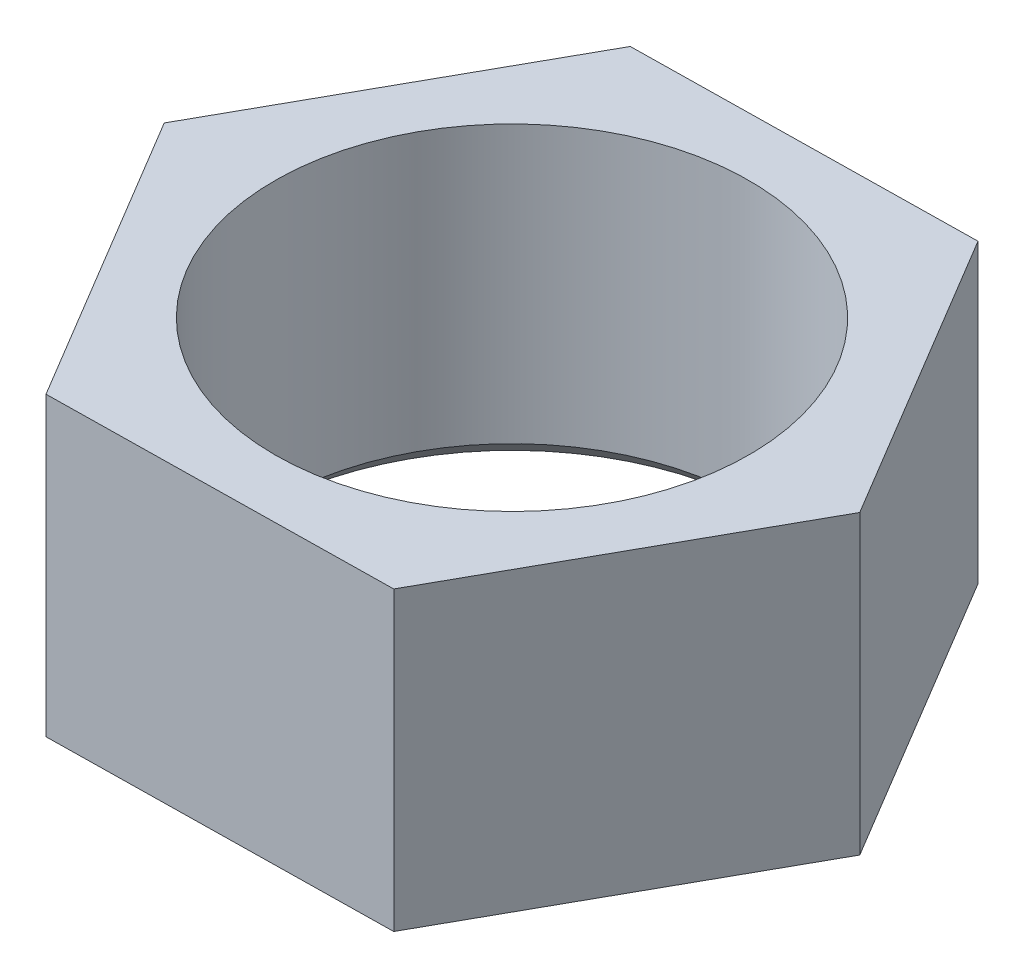
ISO-10303-21;
HEADER;
FILE_DESCRIPTION(('STEP AP214'),'2;1');
FILE_NAME('part.step','',(''),(''),'','','');
FILE_SCHEMA(('AUTOMOTIVE_DESIGN { 1 0 10303 214 1 1 1 1 }'));
ENDSEC;
DATA;
#1=APPLICATION_CONTEXT('core data for automotive mechanical design processes');
#2=APPLICATION_PROTOCOL_DEFINITION('international standard','automotive_design',2000,#1);
#3=PRODUCT_CONTEXT('',#1,'mechanical');
#4=PRODUCT('Part','Part','',(#3));
#5=PRODUCT_RELATED_PRODUCT_CATEGORY('part','',(#4));
#6=PRODUCT_DEFINITION_FORMATION('','',#4);
#7=PRODUCT_DEFINITION_CONTEXT('part definition',#1,'design');
#8=PRODUCT_DEFINITION('design','',#6,#7);
#9=PRODUCT_DEFINITION_SHAPE('','',#8);
#10=(LENGTH_UNIT() NAMED_UNIT(*) SI_UNIT(.MILLI.,.METRE.));
#11=(NAMED_UNIT(*) PLANE_ANGLE_UNIT() SI_UNIT($,.RADIAN.));
#12=(NAMED_UNIT(*) SI_UNIT($,.STERADIAN.) SOLID_ANGLE_UNIT());
#13=UNCERTAINTY_MEASURE_WITH_UNIT(LENGTH_MEASURE(1.E-05),#10,'distance_accuracy_value','');
#14=(GEOMETRIC_REPRESENTATION_CONTEXT(3) GLOBAL_UNCERTAINTY_ASSIGNED_CONTEXT((#13)) GLOBAL_UNIT_ASSIGNED_CONTEXT((#10,
#11,#12)) REPRESENTATION_CONTEXT('',''));
#15=CARTESIAN_POINT('',(0.,0.,0.));
#16=DIRECTION('',(0.,0.,1.));
#17=DIRECTION('',(1.,0.,0.));
#18=AXIS2_PLACEMENT_3D('',#15,#16,#17);
#19=CARTESIAN_POINT('',(-8.43068826921321,15.,15.1302179530683));
#20=DIRECTION('',(-0.0152373569444211,0.,-0.999883904737619));
#21=DIRECTION('',(-0.999883904737619,0.,0.0152373569444211));
#22=AXIS2_PLACEMENT_3D('',#19,#20,#21);
#23=PLANE('',#22);
#24=DIRECTION('',(0.999883904737619,0.,-0.0152373569444211));
#25=VECTOR('',#24,1.);
#26=CARTESIAN_POINT('',(-8.43068826921321,0.,15.1302179530683));
#27=LINE('',#26,#25);
#28=CARTESIAN_POINT('',(-8.43068826921321,0.,15.1302179530683));
#29=VERTEX_POINT('',#28);
#30=CARTESIAN_POINT('',(8.88780897754592,0.,14.8662991890603));
#31=VERTEX_POINT('',#30);
#32=EDGE_CURVE('E133',#29,#31,#27,.T.);
#33=ORIENTED_EDGE('',*,*,#32,.T.);
#34=DIRECTION('',(0.,-1.,0.));
#35=VECTOR('',#34,1.);
#36=CARTESIAN_POINT('',(8.88780897754592,15.,14.8662991890603));
#37=LINE('',#36,#35);
#38=CARTESIAN_POINT('',(8.88780897754592,15.,14.8662991890603));
#39=VERTEX_POINT('',#38);
#40=EDGE_CURVE('E161',#39,#31,#37,.T.);
#41=ORIENTED_EDGE('',*,*,#40,.F.);
#42=DIRECTION('',(0.999883904737619,0.,-0.0152373569444211));
#43=VECTOR('',#42,1.);
#44=CARTESIAN_POINT('',(-8.43068826921321,15.,15.1302179530683));
#45=LINE('',#44,#43);
#46=CARTESIAN_POINT('',(-8.43068826921321,15.,15.1302179530683));
#47=VERTEX_POINT('',#46);
#48=EDGE_CURVE('E150',#47,#39,#45,.T.);
#49=ORIENTED_EDGE('',*,*,#48,.F.);
#50=DIRECTION('',(0.,-1.,0.));
#51=VECTOR('',#50,1.);
#52=CARTESIAN_POINT('',(-8.43068826921321,15.,15.1302179530683));
#53=LINE('',#52,#51);
#54=EDGE_CURVE('E129',#47,#29,#53,.T.);
#55=ORIENTED_EDGE('',*,*,#54,.T.);
#56=EDGE_LOOP('',(#33,#41,#49,#55));
#57=FACE_BOUND('',#56,.T.);
#58=ADVANCED_FACE('F41',(#57),#23,.F.);
#59=CARTESIAN_POINT('',(8.88780897754592,15.,14.8662991890603));
#60=DIRECTION('',(-0.873543540810168,0.,-0.48674601416841));
#61=DIRECTION('',(-0.48674601416841,0.,0.873543540810168));
#62=AXIS2_PLACEMENT_3D('',#59,#60,#61);
#63=PLANE('',#62);
#64=DIRECTION('',(0.48674601416841,0.,-0.873543540810168));
#65=VECTOR('',#64,1.);
#66=CARTESIAN_POINT('',(8.88780897754592,0.,14.8662991890603));
#67=LINE('',#66,#65);
#68=CARTESIAN_POINT('',(17.3184972467592,0.,-0.263918764007998));
#69=VERTEX_POINT('',#68);
#70=EDGE_CURVE('E137',#31,#69,#67,.T.);
#71=ORIENTED_EDGE('',*,*,#70,.T.);
#72=DIRECTION('',(0.,-1.,0.));
#73=VECTOR('',#72,1.);
#74=CARTESIAN_POINT('',(17.3184972467592,15.,-0.263918764007998));
#75=LINE('',#74,#73);
#76=CARTESIAN_POINT('',(17.3184972467592,15.,-0.263918764007998));
#77=VERTEX_POINT('',#76);
#78=EDGE_CURVE('E157',#77,#69,#75,.T.);
#79=ORIENTED_EDGE('',*,*,#78,.F.);
#80=DIRECTION('',(0.48674601416841,0.,-0.873543540810168));
#81=VECTOR('',#80,1.);
#82=CARTESIAN_POINT('',(8.88780897754592,15.,14.8662991890603));
#83=LINE('',#82,#81);
#84=EDGE_CURVE('E98',#39,#77,#83,.T.);
#85=ORIENTED_EDGE('',*,*,#84,.F.);
#86=ORIENTED_EDGE('',*,*,#40,.T.);
#87=EDGE_LOOP('',(#71,#79,#85,#86));
#88=FACE_BOUND('',#87,.T.);
#89=ADVANCED_FACE('F180',(#88),#63,.F.);
#90=CARTESIAN_POINT('',(17.3184972467592,15.,-0.263918764007998));
#91=DIRECTION('',(-0.858306183865748,0.,0.513137890569209));
#92=DIRECTION('',(0.513137890569209,0.,0.858306183865748));
#93=AXIS2_PLACEMENT_3D('',#90,#91,#92);
#94=PLANE('',#93);
#95=DIRECTION('',(-0.513137890569209,0.,-0.858306183865748));
#96=VECTOR('',#95,1.);
#97=CARTESIAN_POINT('',(17.3184972467592,0.,-0.263918764007998));
#98=LINE('',#97,#96);
#99=CARTESIAN_POINT('',(8.4306882692133,0.,-15.1302179530683));
#100=VERTEX_POINT('',#99);
#101=EDGE_CURVE('E141',#69,#100,#98,.T.);
#102=ORIENTED_EDGE('',*,*,#101,.T.);
#103=DIRECTION('',(0.,-1.,0.));
#104=VECTOR('',#103,1.);
#105=CARTESIAN_POINT('',(8.4306882692133,15.,-15.1302179530683));
#106=LINE('',#105,#104);
#107=CARTESIAN_POINT('',(8.4306882692133,15.,-15.1302179530683));
#108=VERTEX_POINT('',#107);
#109=EDGE_CURVE('E122',#108,#100,#106,.T.);
#110=ORIENTED_EDGE('',*,*,#109,.F.);
#111=DIRECTION('',(-0.513137890569209,0.,-0.858306183865748));
#112=VECTOR('',#111,1.);
#113=CARTESIAN_POINT('',(17.3184972467592,15.,-0.263918764007998));
#114=LINE('',#113,#112);
#115=EDGE_CURVE('E111',#77,#108,#114,.T.);
#116=ORIENTED_EDGE('',*,*,#115,.F.);
#117=ORIENTED_EDGE('',*,*,#78,.T.);
#118=EDGE_LOOP('',(#102,#110,#116,#117));
#119=FACE_BOUND('',#118,.T.);
#120=ADVANCED_FACE('F185',(#119),#94,.F.);
#121=CARTESIAN_POINT('',(8.4306882692133,15.,-15.1302179530683));
#122=DIRECTION('',(0.0152373569444207,0.,0.999883904737619));
#123=DIRECTION('',(0.999883904737619,0.,-0.0152373569444207));
#124=AXIS2_PLACEMENT_3D('',#121,#122,#123);
#125=PLANE('',#124);
#126=DIRECTION('',(-0.999883904737619,0.,0.0152373569444207));
#127=VECTOR('',#126,1.);
#128=CARTESIAN_POINT('',(8.4306882692133,0.,-15.1302179530683));
#129=LINE('',#128,#127);
#130=CARTESIAN_POINT('',(-8.88780897754586,0.,-14.8662991890603));
#131=VERTEX_POINT('',#130);
#132=EDGE_CURVE('E120',#100,#131,#129,.T.);
#133=ORIENTED_EDGE('',*,*,#132,.T.);
#134=DIRECTION('',(0.,-1.,0.));
#135=VECTOR('',#134,1.);
#136=CARTESIAN_POINT('',(-8.88780897754586,15.,-14.8662991890603));
#137=LINE('',#136,#135);
#138=CARTESIAN_POINT('',(-8.88780897754586,15.,-14.8662991890603));
#139=VERTEX_POINT('',#138);
#140=EDGE_CURVE('E117',#139,#131,#137,.T.);
#141=ORIENTED_EDGE('',*,*,#140,.F.);
#142=DIRECTION('',(-0.999883904737619,0.,0.0152373569444207));
#143=VECTOR('',#142,1.);
#144=CARTESIAN_POINT('',(8.4306882692133,15.,-15.1302179530683));
#145=LINE('',#144,#143);
#146=EDGE_CURVE('E105',#108,#139,#145,.T.);
#147=ORIENTED_EDGE('',*,*,#146,.F.);
#148=ORIENTED_EDGE('',*,*,#109,.T.);
#149=EDGE_LOOP('',(#133,#141,#147,#148));
#150=FACE_BOUND('',#149,.T.);
#151=ADVANCED_FACE('F118',(#150),#125,.F.);
#152=CARTESIAN_POINT('',(-8.88780897754586,15.,-14.8662991890603));
#153=DIRECTION('',(0.873543540810168,0.,0.48674601416841));
#154=DIRECTION('',(0.48674601416841,0.,-0.873543540810169));
#155=AXIS2_PLACEMENT_3D('',#152,#153,#154);
#156=PLANE('',#155);
#157=DIRECTION('',(-0.48674601416841,0.,0.873543540810169));
#158=VECTOR('',#157,1.);
#159=CARTESIAN_POINT('',(-8.88780897754586,0.,-14.8662991890603));
#160=LINE('',#159,#158);
#161=CARTESIAN_POINT('',(-17.3184972467592,0.,0.263918764007991));
#162=VERTEX_POINT('',#161);
#163=EDGE_CURVE('E83',#131,#162,#160,.T.);
#164=ORIENTED_EDGE('',*,*,#163,.T.);
#165=DIRECTION('',(0.,-1.,0.));
#166=VECTOR('',#165,1.);
#167=CARTESIAN_POINT('',(-17.3184972467592,15.,0.263918764007991));
#168=LINE('',#167,#166);
#169=CARTESIAN_POINT('',(-17.3184972467592,15.,0.263918764007991));
#170=VERTEX_POINT('',#169);
#171=EDGE_CURVE('E123',#170,#162,#168,.T.);
#172=ORIENTED_EDGE('',*,*,#171,.F.);
#173=DIRECTION('',(-0.48674601416841,0.,0.873543540810169));
#174=VECTOR('',#173,1.);
#175=CARTESIAN_POINT('',(-8.88780897754586,15.,-14.8662991890603));
#176=LINE('',#175,#174);
#177=EDGE_CURVE('E109',#139,#170,#176,.T.);
#178=ORIENTED_EDGE('',*,*,#177,.F.);
#179=ORIENTED_EDGE('',*,*,#140,.T.);
#180=EDGE_LOOP('',(#164,#172,#178,#179));
#181=FACE_BOUND('',#180,.T.);
#182=ADVANCED_FACE('F125',(#181),#156,.F.);
#183=CARTESIAN_POINT('',(-17.3184972467592,15.,0.263918764007991));
#184=DIRECTION('',(0.858306183865747,0.,-0.513137890569209));
#185=DIRECTION('',(-0.51313789056921,0.,-0.858306183865747));
#186=AXIS2_PLACEMENT_3D('',#183,#184,#185);
#187=PLANE('',#186);
#188=DIRECTION('',(0.51313789056921,0.,0.858306183865747));
#189=VECTOR('',#188,1.);
#190=CARTESIAN_POINT('',(-17.3184972467592,0.,0.263918764007991));
#191=LINE('',#190,#189);
#192=EDGE_CURVE('E89',#162,#29,#191,.T.);
#193=ORIENTED_EDGE('',*,*,#192,.T.);
#194=ORIENTED_EDGE('',*,*,#54,.F.);
#195=DIRECTION('',(0.51313789056921,0.,0.858306183865747));
#196=VECTOR('',#195,1.);
#197=CARTESIAN_POINT('',(-17.3184972467592,15.,0.263918764007991));
#198=LINE('',#197,#196);
#199=EDGE_CURVE('E60',#170,#47,#198,.T.);
#200=ORIENTED_EDGE('',*,*,#199,.F.);
#201=ORIENTED_EDGE('',*,*,#171,.T.);
#202=EDGE_LOOP('',(#193,#194,#200,#201));
#203=FACE_BOUND('',#202,.T.);
#204=ADVANCED_FACE('F195',(#203),#187,.F.);
#205=CARTESIAN_POINT('',(0.,15.,0.));
#206=DIRECTION('',(0.,1.,0.));
#207=DIRECTION('',(0.,0.,1.));
#208=AXIS2_PLACEMENT_3D('',#205,#206,#207);
#209=PLANE('',#208);
#210=CARTESIAN_POINT('',(0.,15.,0.));
#211=DIRECTION('',(0.,1.,0.));
#212=DIRECTION('',(0.,0.,1.));
#213=AXIS2_PLACEMENT_3D('',#210,#211,#212);
#214=CIRCLE('',#213,12.);
#215=CARTESIAN_POINT('',(0.,15.,12.));
#216=VERTEX_POINT('',#215);
#217=EDGE_CURVE('E138',#216,#216,#214,.T.);
#218=ORIENTED_EDGE('',*,*,#217,.F.);
#219=EDGE_LOOP('',(#218));
#220=FACE_BOUND('',#219,.T.);
#221=ORIENTED_EDGE('',*,*,#48,.T.);
#222=ORIENTED_EDGE('',*,*,#84,.T.);
#223=ORIENTED_EDGE('',*,*,#115,.T.);
#224=ORIENTED_EDGE('',*,*,#146,.T.);
#225=ORIENTED_EDGE('',*,*,#177,.T.);
#226=ORIENTED_EDGE('',*,*,#199,.T.);
#227=EDGE_LOOP('',(#221,#222,#223,#224,#225,#226));
#228=FACE_BOUND('',#227,.T.);
#229=ADVANCED_FACE('F107',(#220,#228),#209,.T.);
#230=CARTESIAN_POINT('',(0.,0.,0.));
#231=DIRECTION('',(0.,1.,0.));
#232=DIRECTION('',(0.,0.,1.));
#233=AXIS2_PLACEMENT_3D('',#230,#231,#232);
#234=PLANE('',#233);
#235=CARTESIAN_POINT('',(0.,0.,0.));
#236=DIRECTION('',(0.,1.,0.));
#237=DIRECTION('',(0.,0.,1.));
#238=AXIS2_PLACEMENT_3D('',#235,#236,#237);
#239=CIRCLE('',#238,13.);
#240=CARTESIAN_POINT('',(0.,0.,13.));
#241=VERTEX_POINT('',#240);
#242=EDGE_CURVE('E52',#241,#241,#239,.T.);
#243=ORIENTED_EDGE('',*,*,#242,.T.);
#244=EDGE_LOOP('',(#243));
#245=FACE_BOUND('',#244,.T.);
#246=ORIENTED_EDGE('',*,*,#32,.F.);
#247=ORIENTED_EDGE('',*,*,#192,.F.);
#248=ORIENTED_EDGE('',*,*,#163,.F.);
#249=ORIENTED_EDGE('',*,*,#132,.F.);
#250=ORIENTED_EDGE('',*,*,#101,.F.);
#251=ORIENTED_EDGE('',*,*,#70,.F.);
#252=EDGE_LOOP('',(#246,#247,#248,#249,#250,#251));
#253=FACE_BOUND('',#252,.T.);
#254=ADVANCED_FACE('F167',(#245,#253),#234,.F.);
#255=CARTESIAN_POINT('',(0.,0.,0.));
#256=DIRECTION('',(0.,1.,0.));
#257=DIRECTION('',(0.,0.,1.));
#258=AXIS2_PLACEMENT_3D('',#255,#256,#257);
#259=CYLINDRICAL_SURFACE('',#258,12.);
#260=CARTESIAN_POINT('',(0.,0.999999999999997,0.));
#261=DIRECTION('',(0.,1.,0.));
#262=DIRECTION('',(0.,0.,1.));
#263=AXIS2_PLACEMENT_3D('',#260,#261,#262);
#264=CIRCLE('',#263,12.);
#265=CARTESIAN_POINT('',(0.,0.999999999999997,12.));
#266=VERTEX_POINT('',#265);
#267=EDGE_CURVE('E11',#266,#266,#264,.F.);
#268=ORIENTED_EDGE('',*,*,#267,.T.);
#269=EDGE_LOOP('',(#268));
#270=FACE_BOUND('',#269,.T.);
#271=ORIENTED_EDGE('',*,*,#217,.T.);
#272=EDGE_LOOP('',(#271));
#273=FACE_BOUND('',#272,.T.);
#274=ADVANCED_FACE('F171',(#270,#273),#259,.F.);
#275=CARTESIAN_POINT('',(0.,0.,0.));
#276=DIRECTION('',(0.,-1.,0.));
#277=DIRECTION('',(0.,0.,-1.));
#278=AXIS2_PLACEMENT_3D('',#275,#276,#277);
#279=CONICAL_SURFACE('',#278,13.,0.785398163397444);
#280=ORIENTED_EDGE('',*,*,#267,.F.);
#281=EDGE_LOOP('',(#280));
#282=FACE_BOUND('',#281,.T.);
#283=ORIENTED_EDGE('',*,*,#242,.F.);
#284=EDGE_LOOP('',(#283));
#285=FACE_BOUND('',#284,.T.);
#286=ADVANCED_FACE('F44',(#282,#285),#279,.F.);
#287=CLOSED_SHELL('',(#58,#89,#120,#151,#182,#204,#229,#254,#274,#286));
#288=MANIFOLD_SOLID_BREP('B2',#287);
#289=ADVANCED_BREP_SHAPE_REPRESENTATION('',(#18,#288),#14);
#290=SHAPE_DEFINITION_REPRESENTATION(#9,#289);
ENDSEC;
END-ISO-10303-21;
